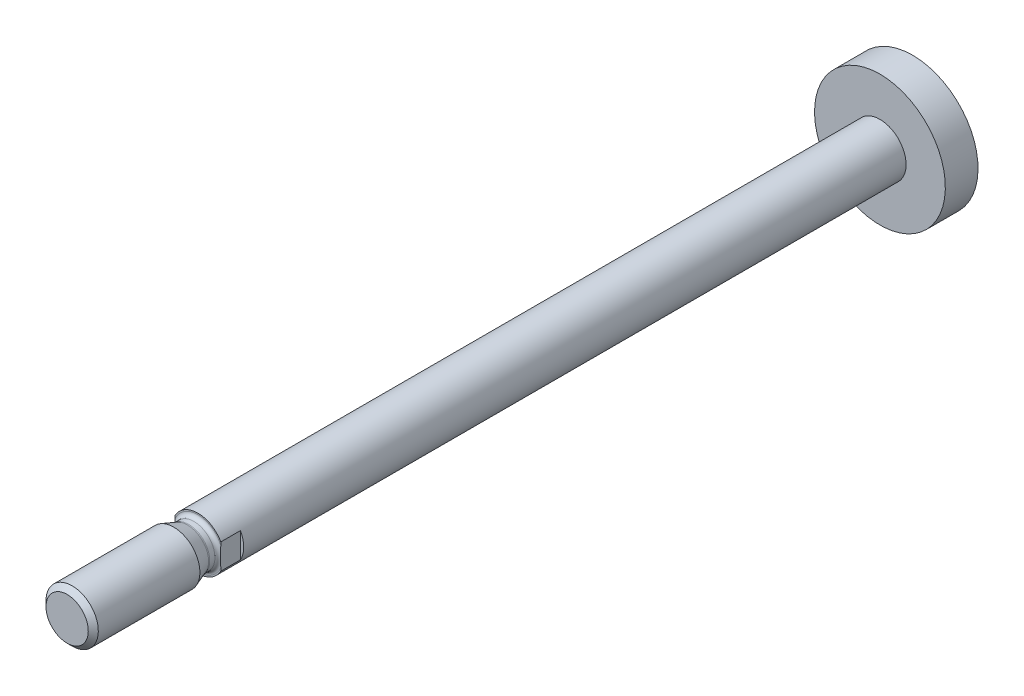
ISO-10303-21;
HEADER;
FILE_DESCRIPTION(('STEP AP214'),'2;1');
FILE_NAME('part.step','',(''),(''),'','','');
FILE_SCHEMA(('AUTOMOTIVE_DESIGN { 1 0 10303 214 1 1 1 1 }'));
ENDSEC;
DATA;
#1=APPLICATION_CONTEXT('core data for automotive mechanical design processes');
#2=APPLICATION_PROTOCOL_DEFINITION('international standard','automotive_design',2000,#1);
#3=PRODUCT_CONTEXT('',#1,'mechanical');
#4=PRODUCT('Part','Part','',(#3));
#5=PRODUCT_RELATED_PRODUCT_CATEGORY('part','',(#4));
#6=PRODUCT_DEFINITION_FORMATION('','',#4);
#7=PRODUCT_DEFINITION_CONTEXT('part definition',#1,'design');
#8=PRODUCT_DEFINITION('design','',#6,#7);
#9=PRODUCT_DEFINITION_SHAPE('','',#8);
#10=(LENGTH_UNIT() NAMED_UNIT(*) SI_UNIT(.MILLI.,.METRE.));
#11=(NAMED_UNIT(*) PLANE_ANGLE_UNIT() SI_UNIT($,.RADIAN.));
#12=(NAMED_UNIT(*) SI_UNIT($,.STERADIAN.) SOLID_ANGLE_UNIT());
#13=UNCERTAINTY_MEASURE_WITH_UNIT(LENGTH_MEASURE(1.E-05),#10,'distance_accuracy_value','');
#14=(GEOMETRIC_REPRESENTATION_CONTEXT(3) GLOBAL_UNCERTAINTY_ASSIGNED_CONTEXT((#13)) GLOBAL_UNIT_ASSIGNED_CONTEXT((#10,
#11,#12)) REPRESENTATION_CONTEXT('',''));
#15=CARTESIAN_POINT('',(0.,0.,0.));
#16=DIRECTION('',(0.,0.,1.));
#17=DIRECTION('',(1.,0.,0.));
#18=AXIS2_PLACEMENT_3D('',#15,#16,#17);
#19=CARTESIAN_POINT('',(0.,3.5,1.));
#20=DIRECTION('',(0.,0.,1.));
#21=DIRECTION('',(1.,0.,0.));
#22=AXIS2_PLACEMENT_3D('',#19,#20,#21);
#23=PLANE('',#22);
#24=CARTESIAN_POINT('',(0.,0.,1.));
#25=DIRECTION('',(0.,0.,-1.));
#26=DIRECTION('',(0.,1.,0.));
#27=AXIS2_PLACEMENT_3D('',#24,#25,#26);
#28=CIRCLE('',#27,4.);
#29=CARTESIAN_POINT('',(-3.5,-1.93649167310371,1.));
#30=VERTEX_POINT('',#29);
#31=CARTESIAN_POINT('',(-3.5,1.93649167310371,1.));
#32=VERTEX_POINT('',#31);
#33=EDGE_CURVE('E35',#30,#32,#28,.T.);
#34=ORIENTED_EDGE('',*,*,#33,.F.);
#35=DIRECTION('',(0.,1.,0.));
#36=VECTOR('',#35,1.);
#37=CARTESIAN_POINT('',(-3.5,-7.,1.));
#38=LINE('',#37,#36);
#39=EDGE_CURVE('E11',#30,#32,#38,.T.);
#40=ORIENTED_EDGE('',*,*,#39,.T.);
#41=EDGE_LOOP('',(#34,#40));
#42=FACE_BOUND('',#41,.T.);
#43=ADVANCED_FACE('F17',(#42),#23,.T.);
#44=CARTESIAN_POINT('',(0.,3.5,1.));
#45=DIRECTION('',(0.,0.,1.));
#46=DIRECTION('',(1.,0.,0.));
#47=AXIS2_PLACEMENT_3D('',#44,#45,#46);
#48=PLANE('',#47);
#49=CARTESIAN_POINT('',(0.,0.,1.));
#50=DIRECTION('',(0.,0.,-1.));
#51=DIRECTION('',(0.,1.,0.));
#52=AXIS2_PLACEMENT_3D('',#49,#50,#51);
#53=CIRCLE('',#52,4.);
#54=CARTESIAN_POINT('',(3.5,1.93649167310371,1.));
#55=VERTEX_POINT('',#54);
#56=CARTESIAN_POINT('',(3.5,-1.93649167310371,1.));
#57=VERTEX_POINT('',#56);
#58=EDGE_CURVE('E108',#55,#57,#53,.T.);
#59=ORIENTED_EDGE('',*,*,#58,.F.);
#60=DIRECTION('',(0.,-1.,0.));
#61=VECTOR('',#60,1.);
#62=CARTESIAN_POINT('',(3.5,7.,1.));
#63=LINE('',#62,#61);
#64=EDGE_CURVE('E28',#55,#57,#63,.T.);
#65=ORIENTED_EDGE('',*,*,#64,.T.);
#66=EDGE_LOOP('',(#59,#65));
#67=FACE_BOUND('',#66,.T.);
#68=ADVANCED_FACE('F200',(#67),#48,.T.);
#69=CARTESIAN_POINT('',(3.5,-7.,1.));
#70=DIRECTION('',(-1.,0.,0.));
#71=DIRECTION('',(0.,0.,1.));
#72=AXIS2_PLACEMENT_3D('',#69,#70,#71);
#73=PLANE('',#72);
#74=DIRECTION('',(0.,0.,-1.));
#75=VECTOR('',#74,1.);
#76=CARTESIAN_POINT('',(3.5,1.93649167310371,-48.15));
#77=LINE('',#76,#75);
#78=CARTESIAN_POINT('',(3.5,1.93649167310371,4.));
#79=VERTEX_POINT('',#78);
#80=EDGE_CURVE('E111',#79,#55,#77,.T.);
#81=ORIENTED_EDGE('',*,*,#80,.F.);
#82=DIRECTION('',(0.,1.,0.));
#83=VECTOR('',#82,1.);
#84=CARTESIAN_POINT('',(3.5,-2.5,4.));
#85=LINE('',#84,#83);
#86=CARTESIAN_POINT('',(3.5,1.47986485869512,4.));
#87=VERTEX_POINT('',#86);
#88=EDGE_CURVE('E98',#87,#79,#85,.T.);
#89=ORIENTED_EDGE('',*,*,#88,.F.);
#90=CARTESIAN_POINT('',(3.50000000000001,-1.47986485869512,4.));
#91=CARTESIAN_POINT('',(3.49997385166981,-1.41364719285552,3.99998591089622));
#92=CARTESIAN_POINT('',(3.49969618852061,-1.34747157733612,4.00166180613654));
#93=CARTESIAN_POINT('',(3.4990045932207,-1.2170768089752,4.00728062158174));
#94=CARTESIAN_POINT('',(3.49859471520598,-1.15285499906759,4.01115842597724));
#95=CARTESIAN_POINT('',(3.49767119993722,-0.96477202572086,4.02438372321805));
#96=CARTESIAN_POINT('',(3.4974161996453,-0.841048906136992,4.03546244461521));
#97=CARTESIAN_POINT('',(3.49782217969339,-0.597290787750861,4.05555110889352));
#98=CARTESIAN_POINT('',(3.49845494196879,-0.477260655450444,4.0646146411578));
#99=CARTESIAN_POINT('',(3.49954484190216,-0.238151288216845,4.07700008680132));
#100=CARTESIAN_POINT('',(3.50000379269435,-0.11907568496423,4.08038261674718));
#101=CARTESIAN_POINT('',(3.49999620796673,0.119054929858971,4.0803868983384));
#102=CARTESIAN_POINT('',(3.49952983374691,0.238109941401075,4.07700982829677));
#103=CARTESIAN_POINT('',(3.49843403532866,0.477190714018542,4.06463004146422));
#104=CARTESIAN_POINT('',(3.49780287941369,0.597212805809242,4.05556604743767));
#105=CARTESIAN_POINT('',(3.49740211833139,0.84096906687824,4.03547416470255));
#106=CARTESIAN_POINT('',(3.49766090433058,0.964698344386719,4.02439244441417));
#107=CARTESIAN_POINT('',(3.49858960452631,1.15279661594347,4.01116292333702));
#108=CARTESIAN_POINT('',(3.49900118343034,1.21702751373033,4.00728365351555));
#109=CARTESIAN_POINT('',(3.49969536643275,1.34744475594969,4.00166247616842));
#110=CARTESIAN_POINT('',(3.49997388195013,1.41363376496566,3.99998584821227));
#111=CARTESIAN_POINT('',(3.5,1.47986485869512,4.));
#112=B_SPLINE_CURVE_WITH_KNOTS('',3,(#90,#91,#92,#93,#94,#95,#96,#97,#98,#99,#100,#101,#102,
#103,#104,#105,#106,#107,#108,#109,#110,#111),.UNSPECIFIED.,.F.,.F.,(4,2,2,2,2,2,2,2,2,2,4),(0.,
0.19857333862724,0.391559273141013,0.764206489691607,1.12527360749043,1.48246305734864,
1.83959024844573,2.2006332136424,2.57329969126895,2.76631311398849,2.96492667090247),.UNSPECIFIED.);
#113=CARTESIAN_POINT('',(3.5,-1.47986485869512,4.));
#114=VERTEX_POINT('',#113);
#115=EDGE_CURVE('E119',#114,#87,#112,.T.);
#116=ORIENTED_EDGE('',*,*,#115,.F.);
#117=DIRECTION('',(0.,1.,0.));
#118=VECTOR('',#117,1.);
#119=CARTESIAN_POINT('',(3.5,-2.5,4.));
#120=LINE('',#119,#118);
#121=CARTESIAN_POINT('',(3.5,-1.93649167310371,4.));
#122=VERTEX_POINT('',#121);
#123=EDGE_CURVE('E223',#122,#114,#120,.T.);
#124=ORIENTED_EDGE('',*,*,#123,.F.);
#125=DIRECTION('',(0.,0.,1.));
#126=VECTOR('',#125,1.);
#127=CARTESIAN_POINT('',(3.5,-1.93649167310371,-48.15));
#128=LINE('',#127,#126);
#129=EDGE_CURVE('E106',#57,#122,#128,.T.);
#130=ORIENTED_EDGE('',*,*,#129,.F.);
#131=ORIENTED_EDGE('',*,*,#64,.F.);
#132=EDGE_LOOP('',(#81,#89,#116,#124,#130,#131));
#133=FACE_BOUND('',#132,.T.);
#134=ADVANCED_FACE('F176',(#133),#73,.F.);
#135=CARTESIAN_POINT('',(-3.5,7.,1.));
#136=DIRECTION('',(1.,0.,0.));
#137=DIRECTION('',(0.,0.,-1.));
#138=AXIS2_PLACEMENT_3D('',#135,#136,#137);
#139=PLANE('',#138);
#140=DIRECTION('',(0.,0.,-1.));
#141=VECTOR('',#140,1.);
#142=CARTESIAN_POINT('',(-3.5,-1.93649167310371,-48.15));
#143=LINE('',#142,#141);
#144=CARTESIAN_POINT('',(-3.5,-1.93649167310371,4.));
#145=VERTEX_POINT('',#144);
#146=EDGE_CURVE('E107',#145,#30,#143,.T.);
#147=ORIENTED_EDGE('',*,*,#146,.F.);
#148=DIRECTION('',(0.,-1.,0.));
#149=VECTOR('',#148,1.);
#150=CARTESIAN_POINT('',(-3.5,4.5,4.));
#151=LINE('',#150,#149);
#152=CARTESIAN_POINT('',(-3.5,-1.47986485869512,4.));
#153=VERTEX_POINT('',#152);
#154=EDGE_CURVE('E230',#153,#145,#151,.T.);
#155=ORIENTED_EDGE('',*,*,#154,.F.);
#156=CARTESIAN_POINT('',(-3.5,1.47986485869513,4.));
#157=CARTESIAN_POINT('',(-3.4999738668032,1.4136404781612,3.99998587955423));
#158=CARTESIAN_POINT('',(-3.499695777443,1.34745816514319,4.00166214117364));
#159=CARTESIAN_POINT('',(-3.49900288820608,1.21705215857975,4.00728213763918));
#160=CARTESIAN_POINT('',(-3.49859215967588,1.15282580421011,4.01116067479571));
#161=CARTESIAN_POINT('',(-3.49766605167719,0.96473518085744,4.02438808411564));
#162=CARTESIAN_POINT('',(-3.49740915832801,0.841008981927378,4.03546830508518));
#163=CARTESIAN_POINT('',(-3.49781252860397,0.597251792313112,4.05555857875415));
#164=CARTESIAN_POINT('',(-3.49844448766272,0.477225680757905,4.06462234191103));
#165=CARTESIAN_POINT('',(-3.49953733702764,0.238130612481019,4.07700495800879));
#166=CARTESIAN_POINT('',(-3.5,0.11906530624051,4.08038475772938));
#167=CARTESIAN_POINT('',(-3.5,-0.11906530624051,4.08038475772938));
#168=CARTESIAN_POINT('',(-3.49953733702764,-0.23813061248102,4.07700495800879));
#169=CARTESIAN_POINT('',(-3.49844448766272,-0.477225680757907,4.06462234191103));
#170=CARTESIAN_POINT('',(-3.49781252860397,-0.597251792313113,4.05555857875415));
#171=CARTESIAN_POINT('',(-3.49740915832801,-0.84100898192738,4.03546830508518));
#172=CARTESIAN_POINT('',(-3.49766605167718,-0.964735180857442,4.02438808411564));
#173=CARTESIAN_POINT('',(-3.49859215967588,-1.15282580421012,4.01116067479571));
#174=CARTESIAN_POINT('',(-3.49900288820608,-1.21705215857975,4.00728213763918));
#175=CARTESIAN_POINT('',(-3.499695777443,-1.34745816514319,4.00166214117364));
#176=CARTESIAN_POINT('',(-3.4999738668032,-1.41364047816121,3.99998587955423));
#177=CARTESIAN_POINT('',(-3.5,-1.47986485869513,4.));
#178=B_SPLINE_CURVE_WITH_KNOTS('',3,(#156,#157,#158,#159,#160,#161,#162,#163,#164,#165,#166,
#167,#168,#169,#170,#171,#172,#173,#174,#175,#176,#177),.UNSPECIFIED.,.F.,.F.,(4,2,2,2,2,2,2,2,
2,2,4),(0.,0.198593450020453,0.391593130193361,0.76424997837966,1.12530501847935,
1.48246333525152,1.8396216520237,2.20067669212339,2.57333354030969,2.7663332204826,
2.96492667050305),.UNSPECIFIED.);
#179=CARTESIAN_POINT('',(-3.5,1.47986485869512,4.));
#180=VERTEX_POINT('',#179);
#181=EDGE_CURVE('E158',#180,#153,#178,.T.);
#182=ORIENTED_EDGE('',*,*,#181,.F.);
#183=DIRECTION('',(0.,-1.,0.));
#184=VECTOR('',#183,1.);
#185=CARTESIAN_POINT('',(-3.5,4.5,4.));
#186=LINE('',#185,#184);
#187=CARTESIAN_POINT('',(-3.5,1.93649167310371,4.));
#188=VERTEX_POINT('',#187);
#189=EDGE_CURVE('E163',#188,#180,#186,.T.);
#190=ORIENTED_EDGE('',*,*,#189,.F.);
#191=DIRECTION('',(0.,0.,1.));
#192=VECTOR('',#191,1.);
#193=CARTESIAN_POINT('',(-3.5,1.93649167310371,-48.15));
#194=LINE('',#193,#192);
#195=EDGE_CURVE('E269',#32,#188,#194,.T.);
#196=ORIENTED_EDGE('',*,*,#195,.F.);
#197=ORIENTED_EDGE('',*,*,#39,.F.);
#198=EDGE_LOOP('',(#147,#155,#182,#190,#196,#197));
#199=FACE_BOUND('',#198,.T.);
#200=ADVANCED_FACE('F165',(#199),#139,.F.);
#201=CARTESIAN_POINT('',(0.,0.,-48.15));
#202=DIRECTION('',(0.,0.,1.));
#203=DIRECTION('',(0.,1.,0.));
#204=AXIS2_PLACEMENT_3D('',#201,#202,#203);
#205=CYLINDRICAL_SURFACE('',#204,4.);
#206=CARTESIAN_POINT('',(0.,0.,-100.3));
#207=DIRECTION('',(0.,0.,-1.));
#208=DIRECTION('',(0.,1.,0.));
#209=AXIS2_PLACEMENT_3D('',#206,#207,#208);
#210=CIRCLE('',#209,4.);
#211=CARTESIAN_POINT('',(0.,4.,-100.3));
#212=VERTEX_POINT('',#211);
#213=EDGE_CURVE('E257',#212,#212,#210,.T.);
#214=ORIENTED_EDGE('',*,*,#213,.F.);
#215=EDGE_LOOP('',(#214));
#216=FACE_BOUND('',#215,.T.);
#217=ORIENTED_EDGE('',*,*,#80,.T.);
#218=ORIENTED_EDGE('',*,*,#58,.T.);
#219=ORIENTED_EDGE('',*,*,#129,.T.);
#220=CARTESIAN_POINT('',(0.,0.,4.));
#221=DIRECTION('',(0.,0.,-1.));
#222=DIRECTION('',(0.,1.,0.));
#223=AXIS2_PLACEMENT_3D('',#220,#221,#222);
#224=CIRCLE('',#223,4.);
#225=EDGE_CURVE('E103',#122,#145,#224,.T.);
#226=ORIENTED_EDGE('',*,*,#225,.T.);
#227=ORIENTED_EDGE('',*,*,#146,.T.);
#228=ORIENTED_EDGE('',*,*,#33,.T.);
#229=ORIENTED_EDGE('',*,*,#195,.T.);
#230=CARTESIAN_POINT('',(0.,0.,4.));
#231=DIRECTION('',(0.,0.,-1.));
#232=DIRECTION('',(0.,1.,0.));
#233=AXIS2_PLACEMENT_3D('',#230,#231,#232);
#234=CIRCLE('',#233,4.);
#235=EDGE_CURVE('E229',#188,#79,#234,.T.);
#236=ORIENTED_EDGE('',*,*,#235,.T.);
#237=EDGE_LOOP('',(#217,#218,#219,#226,#227,#228,#229,#236));
#238=FACE_BOUND('',#237,.T.);
#239=ADVANCED_FACE('F175',(#216,#238),#205,.T.);
#240=CARTESIAN_POINT('',(0.,2.,4.));
#241=DIRECTION('',(0.,0.,1.));
#242=DIRECTION('',(1.,0.,0.));
#243=AXIS2_PLACEMENT_3D('',#240,#241,#242);
#244=PLANE('',#243);
#245=ORIENTED_EDGE('',*,*,#123,.T.);
#246=CARTESIAN_POINT('',(0.,0.,4.));
#247=DIRECTION('',(0.,0.,1.));
#248=DIRECTION('',(-1.,0.,0.));
#249=AXIS2_PLACEMENT_3D('',#246,#247,#248);
#250=CIRCLE('',#249,3.8000000000001);
#251=EDGE_CURVE('E224',#153,#114,#250,.T.);
#252=ORIENTED_EDGE('',*,*,#251,.F.);
#253=ORIENTED_EDGE('',*,*,#154,.T.);
#254=ORIENTED_EDGE('',*,*,#225,.F.);
#255=EDGE_LOOP('',(#245,#252,#253,#254));
#256=FACE_BOUND('',#255,.T.);
#257=ADVANCED_FACE('F137',(#256),#244,.T.);
#258=CARTESIAN_POINT('',(0.,0.,4.6000000000001));
#259=DIRECTION('',(0.,0.,-1.));
#260=DIRECTION('',(-1.,0.,0.));
#261=AXIS2_PLACEMENT_3D('',#258,#259,#260);
#262=TOROIDAL_SURFACE('',#261,3.8000000000001,0.600000000000097);
#263=ORIENTED_EDGE('',*,*,#115,.T.);
#264=CARTESIAN_POINT('',(0.,0.,4.));
#265=DIRECTION('',(0.,0.,1.));
#266=DIRECTION('',(-1.,0.,0.));
#267=AXIS2_PLACEMENT_3D('',#264,#265,#266);
#268=CIRCLE('',#267,3.8000000000001);
#269=EDGE_CURVE('E234',#87,#180,#268,.T.);
#270=ORIENTED_EDGE('',*,*,#269,.T.);
#271=ORIENTED_EDGE('',*,*,#181,.T.);
#272=ORIENTED_EDGE('',*,*,#251,.T.);
#273=EDGE_LOOP('',(#263,#270,#271,#272));
#274=FACE_BOUND('',#273,.T.);
#275=CARTESIAN_POINT('',(0.,0.,4.6));
#276=DIRECTION('',(0.,0.,-1.));
#277=DIRECTION('',(0.,1.,0.));
#278=AXIS2_PLACEMENT_3D('',#275,#276,#277);
#279=CIRCLE('',#278,3.2);
#280=CARTESIAN_POINT('',(0.,3.2,4.6));
#281=VERTEX_POINT('',#280);
#282=EDGE_CURVE('E102',#281,#281,#279,.T.);
#283=ORIENTED_EDGE('',*,*,#282,.T.);
#284=EDGE_LOOP('',(#283));
#285=FACE_BOUND('',#284,.T.);
#286=ADVANCED_FACE('F126',(#274,#285),#262,.F.);
#287=CARTESIAN_POINT('',(0.,0.,23.6165));
#288=DIRECTION('',(0.,0.,-1.));
#289=DIRECTION('',(0.,1.,0.));
#290=AXIS2_PLACEMENT_3D('',#287,#288,#289);
#291=CONICAL_SURFACE('',#290,3.6165,0.785398163397447);
#292=CARTESIAN_POINT('',(0.,0.,23.233));
#293=DIRECTION('',(0.,0.,-1.));
#294=DIRECTION('',(0.,1.,0.));
#295=AXIS2_PLACEMENT_3D('',#292,#293,#294);
#296=CIRCLE('',#295,4.);
#297=CARTESIAN_POINT('',(0.,4.,23.233));
#298=VERTEX_POINT('',#297);
#299=EDGE_CURVE('E94',#298,#298,#296,.T.);
#300=ORIENTED_EDGE('',*,*,#299,.F.);
#301=EDGE_LOOP('',(#300));
#302=FACE_BOUND('',#301,.T.);
#303=CARTESIAN_POINT('',(0.,0.,24.));
#304=DIRECTION('',(0.,0.,-1.));
#305=DIRECTION('',(0.,1.,0.));
#306=AXIS2_PLACEMENT_3D('',#303,#304,#305);
#307=CIRCLE('',#306,3.233);
#308=CARTESIAN_POINT('',(0.,3.233,24.));
#309=VERTEX_POINT('',#308);
#310=EDGE_CURVE('E74',#309,#309,#307,.T.);
#311=ORIENTED_EDGE('',*,*,#310,.T.);
#312=EDGE_LOOP('',(#311));
#313=FACE_BOUND('',#312,.T.);
#314=ADVANCED_FACE('F136',(#302,#313),#291,.T.);
#315=CARTESIAN_POINT('',(0.,0.,15.4654909677819));
#316=DIRECTION('',(0.,0.,1.));
#317=DIRECTION('',(0.,1.,0.));
#318=AXIS2_PLACEMENT_3D('',#315,#316,#317);
#319=CYLINDRICAL_SURFACE('',#318,4.);
#320=CARTESIAN_POINT('',(0.,0.,7.6979819355637));
#321=DIRECTION('',(0.,0.,-1.));
#322=DIRECTION('',(0.,1.,0.));
#323=AXIS2_PLACEMENT_3D('',#320,#321,#322);
#324=CIRCLE('',#323,4.);
#325=CARTESIAN_POINT('',(0.,4.,7.6979819355637));
#326=VERTEX_POINT('',#325);
#327=EDGE_CURVE('E78',#326,#326,#324,.T.);
#328=ORIENTED_EDGE('',*,*,#327,.F.);
#329=EDGE_LOOP('',(#328));
#330=FACE_BOUND('',#329,.T.);
#331=ORIENTED_EDGE('',*,*,#299,.T.);
#332=EDGE_LOOP('',(#331));
#333=FACE_BOUND('',#332,.T.);
#334=ADVANCED_FACE('F19',(#330,#333),#319,.T.);
#335=CARTESIAN_POINT('',(0.,0.,6.648698916567));
#336=DIRECTION('',(0.,0.,1.));
#337=DIRECTION('',(0.,1.,0.));
#338=AXIS2_PLACEMENT_3D('',#335,#336,#337);
#339=CONICAL_SURFACE('',#338,3.61809221376425,0.349065850398843);
#340=CARTESIAN_POINT('',(0.,0.,5.5994158975703));
#341=DIRECTION('',(0.,0.,-1.));
#342=DIRECTION('',(0.,1.,0.));
#343=AXIS2_PLACEMENT_3D('',#340,#341,#342);
#344=CIRCLE('',#343,3.2361844275285);
#345=CARTESIAN_POINT('',(0.,3.2361844275285,5.5994158975703));
#346=VERTEX_POINT('',#345);
#347=EDGE_CURVE('E82',#346,#346,#344,.T.);
#348=ORIENTED_EDGE('',*,*,#347,.F.);
#349=EDGE_LOOP('',(#348));
#350=FACE_BOUND('',#349,.T.);
#351=ORIENTED_EDGE('',*,*,#327,.T.);
#352=EDGE_LOOP('',(#351));
#353=FACE_BOUND('',#352,.T.);
#354=ADVANCED_FACE('F83',(#350,#353),#339,.T.);
#355=CARTESIAN_POINT('',(0.,0.,5.39420381157483));
#356=DIRECTION('',(0.,0.,-1.));
#357=DIRECTION('',(-1.,0.,0.));
#358=AXIS2_PLACEMENT_3D('',#355,#356,#357);
#359=TOROIDAL_SURFACE('',#358,3.7999999999997,0.599999999999705);
#360=CARTESIAN_POINT('',(0.,0.,5.3942038115749));
#361=DIRECTION('',(0.,0.,-1.));
#362=DIRECTION('',(0.,1.,0.));
#363=AXIS2_PLACEMENT_3D('',#360,#361,#362);
#364=CIRCLE('',#363,3.2);
#365=CARTESIAN_POINT('',(0.,3.2,5.3942038115749));
#366=VERTEX_POINT('',#365);
#367=EDGE_CURVE('E87',#366,#366,#364,.T.);
#368=ORIENTED_EDGE('',*,*,#367,.F.);
#369=EDGE_LOOP('',(#368));
#370=FACE_BOUND('',#369,.T.);
#371=ORIENTED_EDGE('',*,*,#347,.T.);
#372=EDGE_LOOP('',(#371));
#373=FACE_BOUND('',#372,.T.);
#374=ADVANCED_FACE('F187',(#370,#373),#359,.F.);
#375=CARTESIAN_POINT('',(0.,0.,4.99710190578745));
#376=DIRECTION('',(0.,0.,1.));
#377=DIRECTION('',(0.,1.,0.));
#378=AXIS2_PLACEMENT_3D('',#375,#376,#377);
#379=CYLINDRICAL_SURFACE('',#378,3.2);
#380=ORIENTED_EDGE('',*,*,#282,.F.);
#381=EDGE_LOOP('',(#380));
#382=FACE_BOUND('',#381,.T.);
#383=ORIENTED_EDGE('',*,*,#367,.T.);
#384=EDGE_LOOP('',(#383));
#385=FACE_BOUND('',#384,.T.);
#386=ADVANCED_FACE('F189',(#382,#385),#379,.T.);
#387=CARTESIAN_POINT('',(0.,1.6165,24.));
#388=DIRECTION('',(0.,0.,1.));
#389=DIRECTION('',(1.,0.,0.));
#390=AXIS2_PLACEMENT_3D('',#387,#388,#389);
#391=PLANE('',#390);
#392=ORIENTED_EDGE('',*,*,#310,.F.);
#393=EDGE_LOOP('',(#392));
#394=FACE_BOUND('',#393,.T.);
#395=ADVANCED_FACE('F138',(#394),#391,.T.);
#396=CARTESIAN_POINT('',(0.,2.,4.));
#397=DIRECTION('',(0.,0.,1.));
#398=DIRECTION('',(1.,0.,0.));
#399=AXIS2_PLACEMENT_3D('',#396,#397,#398);
#400=PLANE('',#399);
#401=ORIENTED_EDGE('',*,*,#88,.T.);
#402=ORIENTED_EDGE('',*,*,#235,.F.);
#403=ORIENTED_EDGE('',*,*,#189,.T.);
#404=ORIENTED_EDGE('',*,*,#269,.F.);
#405=EDGE_LOOP('',(#401,#402,#403,#404));
#406=FACE_BOUND('',#405,.T.);
#407=ADVANCED_FACE('F183',(#406),#400,.T.);
#408=CARTESIAN_POINT('',(0.,7.,-100.3));
#409=DIRECTION('',(0.,0.,1.));
#410=DIRECTION('',(1.,0.,0.));
#411=AXIS2_PLACEMENT_3D('',#408,#409,#410);
#412=PLANE('',#411);
#413=CARTESIAN_POINT('',(0.,0.,-100.3));
#414=DIRECTION('',(0.,0.,-1.));
#415=DIRECTION('',(0.,1.,0.));
#416=AXIS2_PLACEMENT_3D('',#413,#414,#415);
#417=CIRCLE('',#416,10.);
#418=CARTESIAN_POINT('',(0.,10.,-100.3));
#419=VERTEX_POINT('',#418);
#420=EDGE_CURVE('E261',#419,#419,#417,.T.);
#421=ORIENTED_EDGE('',*,*,#420,.F.);
#422=EDGE_LOOP('',(#421));
#423=FACE_BOUND('',#422,.T.);
#424=ORIENTED_EDGE('',*,*,#213,.T.);
#425=EDGE_LOOP('',(#424));
#426=FACE_BOUND('',#425,.T.);
#427=ADVANCED_FACE('F179',(#423,#426),#412,.T.);
#428=CARTESIAN_POINT('',(0.,0.,-102.8));
#429=DIRECTION('',(0.,0.,1.));
#430=DIRECTION('',(0.,1.,0.));
#431=AXIS2_PLACEMENT_3D('',#428,#429,#430);
#432=CYLINDRICAL_SURFACE('',#431,10.);
#433=CARTESIAN_POINT('',(0.,0.,-105.3));
#434=DIRECTION('',(0.,0.,-1.));
#435=DIRECTION('',(0.,1.,0.));
#436=AXIS2_PLACEMENT_3D('',#433,#434,#435);
#437=CIRCLE('',#436,10.);
#438=CARTESIAN_POINT('',(0.,10.,-105.3));
#439=VERTEX_POINT('',#438);
#440=EDGE_CURVE('E265',#439,#439,#437,.T.);
#441=ORIENTED_EDGE('',*,*,#440,.F.);
#442=EDGE_LOOP('',(#441));
#443=FACE_BOUND('',#442,.T.);
#444=ORIENTED_EDGE('',*,*,#420,.T.);
#445=EDGE_LOOP('',(#444));
#446=FACE_BOUND('',#445,.T.);
#447=ADVANCED_FACE('F182',(#443,#446),#432,.T.);
#448=CARTESIAN_POINT('',(0.,5.,-105.3));
#449=DIRECTION('',(0.,0.,-1.));
#450=DIRECTION('',(-1.,0.,0.));
#451=AXIS2_PLACEMENT_3D('',#448,#449,#450);
#452=PLANE('',#451);
#453=ORIENTED_EDGE('',*,*,#440,.T.);
#454=EDGE_LOOP('',(#453));
#455=FACE_BOUND('',#454,.T.);
#456=ADVANCED_FACE('F177',(#455),#452,.T.);
#457=CLOSED_SHELL('',(#43,#68,#134,#200,#239,#257,#286,#314,#334,#354,#374,#386,#395,#407,#427,
#447,#456));
#458=MANIFOLD_SOLID_BREP('B1',#457);
#459=ADVANCED_BREP_SHAPE_REPRESENTATION('',(#18,#458),#14);
#460=SHAPE_DEFINITION_REPRESENTATION(#9,#459);
ENDSEC;
END-ISO-10303-21;
